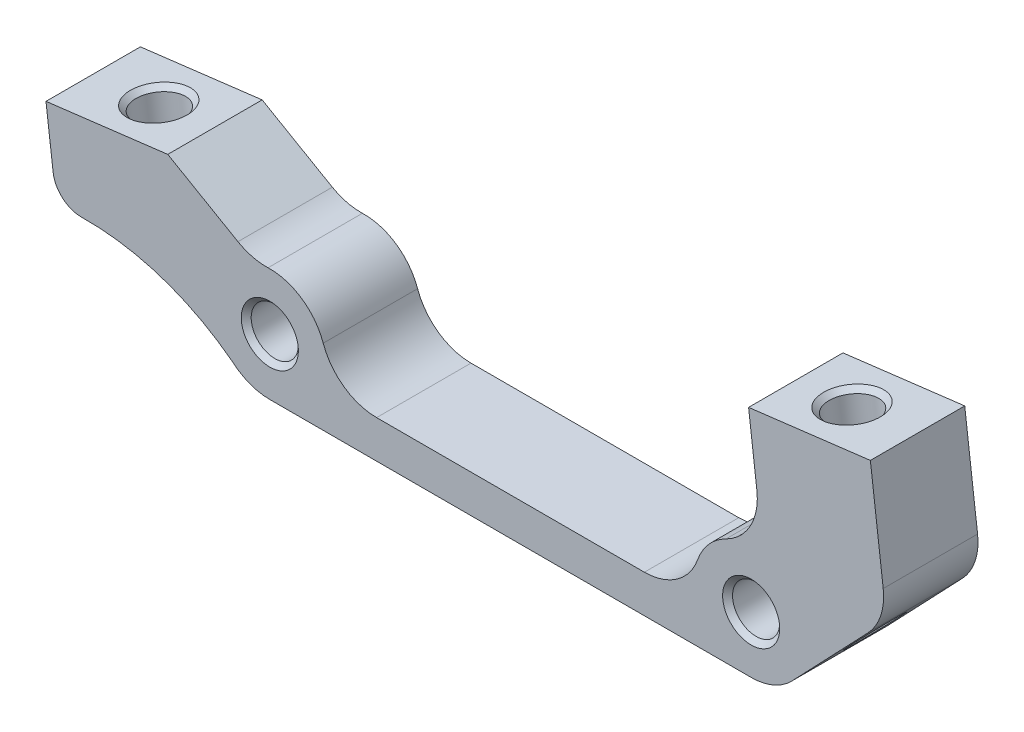
ISO-10303-21;
HEADER;
FILE_DESCRIPTION(('STEP AP214'),'2;1');
FILE_NAME('part.step','',(''),(''),'','','');
FILE_SCHEMA(('AUTOMOTIVE_DESIGN { 1 0 10303 214 1 1 1 1 }'));
ENDSEC;
DATA;
#1=APPLICATION_CONTEXT('core data for automotive mechanical design processes');
#2=APPLICATION_PROTOCOL_DEFINITION('international standard','automotive_design',2000,#1);
#3=PRODUCT_CONTEXT('',#1,'mechanical');
#4=PRODUCT('Part','Part','',(#3));
#5=PRODUCT_RELATED_PRODUCT_CATEGORY('part','',(#4));
#6=PRODUCT_DEFINITION_FORMATION('','',#4);
#7=PRODUCT_DEFINITION_CONTEXT('part definition',#1,'design');
#8=PRODUCT_DEFINITION('design','',#6,#7);
#9=PRODUCT_DEFINITION_SHAPE('','',#8);
#10=(LENGTH_UNIT() NAMED_UNIT(*) SI_UNIT(.MILLI.,.METRE.));
#11=(NAMED_UNIT(*) PLANE_ANGLE_UNIT() SI_UNIT($,.RADIAN.));
#12=(NAMED_UNIT(*) SI_UNIT($,.STERADIAN.) SOLID_ANGLE_UNIT());
#13=UNCERTAINTY_MEASURE_WITH_UNIT(LENGTH_MEASURE(1.E-05),#10,'distance_accuracy_value','');
#14=(GEOMETRIC_REPRESENTATION_CONTEXT(3) GLOBAL_UNCERTAINTY_ASSIGNED_CONTEXT((#13)) GLOBAL_UNIT_ASSIGNED_CONTEXT((#10,
#11,#12)) REPRESENTATION_CONTEXT('',''));
#15=CARTESIAN_POINT('',(0.,0.,0.));
#16=DIRECTION('',(0.,0.,1.));
#17=DIRECTION('',(1.,0.,0.));
#18=AXIS2_PLACEMENT_3D('',#15,#16,#17);
#19=CARTESIAN_POINT('',(112.905556123764,-10.155940073723,10.));
#20=DIRECTION('',(0.,0.,-1.));
#21=DIRECTION('',(-1.,0.,0.));
#22=AXIS2_PLACEMENT_3D('',#19,#20,#21);
#23=PLANE('',#22);
#24=CARTESIAN_POINT('',(67.2545349565775,-20.8978405315615,10.));
#25=DIRECTION('',(0.,0.,1.));
#26=DIRECTION('',(1.,0.,0.));
#27=AXIS2_PLACEMENT_3D('',#24,#25,#26);
#28=CIRCLE('',#27,3.025);
#29=CARTESIAN_POINT('',(70.2795349565775,-20.8978405315615,10.));
#30=VERTEX_POINT('',#29);
#31=EDGE_CURVE('E369',#30,#30,#28,.T.);
#32=ORIENTED_EDGE('',*,*,#31,.F.);
#33=EDGE_LOOP('',(#32));
#34=FACE_BOUND('',#33,.T.);
#35=DIRECTION('',(-0.992546151641322,-0.121869343405148,0.));
#36=VECTOR('',#35,1.);
#37=CARTESIAN_POINT('',(130.883213408734,-0.667537051545507,10.));
#38=LINE('',#37,#36);
#39=CARTESIAN_POINT('',(130.883213408734,-0.667537051545507,10.));
#40=VERTEX_POINT('',#39);
#41=CARTESIAN_POINT('',(117.980113437397,-2.25183851581243,10.));
#42=VERTEX_POINT('',#41);
#43=EDGE_CURVE('E294',#40,#42,#38,.T.);
#44=ORIENTED_EDGE('',*,*,#43,.T.);
#45=DIRECTION('',(0.121869343405149,-0.992546151641322,0.));
#46=VECTOR('',#45,1.);
#47=CARTESIAN_POINT('',(117.980113437397,-2.25183851581243,10.));
#48=LINE('',#47,#46);
#49=CARTESIAN_POINT('',(118.860833033612,-9.42472401329213,10.));
#50=VERTEX_POINT('',#49);
#51=EDGE_CURVE('E157',#42,#50,#48,.T.);
#52=ORIENTED_EDGE('',*,*,#51,.T.);
#53=CARTESIAN_POINT('',(112.905556123764,-10.155940073723,10.));
#54=DIRECTION('',(0.,0.,-1.));
#55=DIRECTION('',(-1.,0.,0.));
#56=AXIS2_PLACEMENT_3D('',#53,#54,#55);
#57=CIRCLE('',#56,6.00000000000001);
#58=CARTESIAN_POINT('',(115.580045540171,-15.5268903026422,10.));
#59=VERTEX_POINT('',#58);
#60=EDGE_CURVE('E411',#50,#59,#57,.T.);
#61=ORIENTED_EDGE('',*,*,#60,.T.);
#62=CARTESIAN_POINT('',(118.254534956578,-20.8978405315615,10.));
#63=DIRECTION('',(0.,0.,1.));
#64=DIRECTION('',(1.,0.,0.));
#65=AXIS2_PLACEMENT_3D('',#62,#63,#64);
#66=CIRCLE('',#65,5.99999999999999);
#67=CARTESIAN_POINT('',(112.597680707085,-18.8978405315615,10.));
#68=VERTEX_POINT('',#67);
#69=EDGE_CURVE('E413',#59,#68,#66,.T.);
#70=ORIENTED_EDGE('',*,*,#69,.T.);
#71=CARTESIAN_POINT('',(106.940826457593,-16.8978405315615,10.));
#72=DIRECTION('',(0.,0.,-1.));
#73=DIRECTION('',(1.,0.,0.));
#74=AXIS2_PLACEMENT_3D('',#71,#72,#73);
#75=CIRCLE('',#74,6.);
#76=CARTESIAN_POINT('',(106.940826457593,-22.8978405315615,10.));
#77=VERTEX_POINT('',#76);
#78=EDGE_CURVE('E416',#68,#77,#75,.T.);
#79=ORIENTED_EDGE('',*,*,#78,.T.);
#80=DIRECTION('',(-1.,0.,0.));
#81=VECTOR('',#80,1.);
#82=CARTESIAN_POINT('',(78.5682434555623,-22.8978405315615,10.));
#83=LINE('',#82,#81);
#84=CARTESIAN_POINT('',(78.5682434555623,-22.8978405315615,10.));
#85=VERTEX_POINT('',#84);
#86=EDGE_CURVE('E419',#77,#85,#83,.T.);
#87=ORIENTED_EDGE('',*,*,#86,.T.);
#88=CARTESIAN_POINT('',(78.5682434555623,-16.8978405315615,10.));
#89=DIRECTION('',(0.,0.,-1.));
#90=DIRECTION('',(-1.,0.,0.));
#91=AXIS2_PLACEMENT_3D('',#88,#89,#90);
#92=CIRCLE('',#91,6.);
#93=CARTESIAN_POINT('',(72.9113892060699,-18.8978405315615,10.));
#94=VERTEX_POINT('',#93);
#95=EDGE_CURVE('E422',#85,#94,#92,.T.);
#96=ORIENTED_EDGE('',*,*,#95,.T.);
#97=CARTESIAN_POINT('',(67.2545349565775,-20.8978405315615,10.));
#98=DIRECTION('',(0.,0.,1.));
#99=DIRECTION('',(1.,0.,0.));
#100=AXIS2_PLACEMENT_3D('',#97,#98,#99);
#101=CIRCLE('',#100,5.99999999999999);
#102=CARTESIAN_POINT('',(67.0655553874647,-14.9008173764905,10.));
#103=VERTEX_POINT('',#102);
#104=EDGE_CURVE('E425',#94,#103,#101,.T.);
#105=ORIENTED_EDGE('',*,*,#104,.T.);
#106=CARTESIAN_POINT('',(66.8765758183518,-8.90379422141946,10.));
#107=DIRECTION('',(0.,0.,-1.));
#108=DIRECTION('',(1.,0.,0.));
#109=AXIS2_PLACEMENT_3D('',#106,#107,#108);
#110=CIRCLE('',#109,6.);
#111=CARTESIAN_POINT('',(63.8765758183518,-14.0999466441261,10.));
#112=VERTEX_POINT('',#111);
#113=EDGE_CURVE('E428',#103,#112,#110,.T.);
#114=ORIENTED_EDGE('',*,*,#113,.T.);
#115=DIRECTION('',(-0.866025403784438,0.500000000000001,0.));
#116=VECTOR('',#115,1.);
#117=CARTESIAN_POINT('',(56.4422520356348,-9.80773780693161,10.));
#118=LINE('',#117,#116);
#119=CARTESIAN_POINT('',(56.4422520356348,-9.80773780693161,10.));
#120=VERTEX_POINT('',#119);
#121=EDGE_CURVE('E431',#112,#120,#118,.T.);
#122=ORIENTED_EDGE('',*,*,#121,.T.);
#123=DIRECTION('',(-0.992546151641322,-0.121869343405148,0.));
#124=VECTOR('',#123,1.);
#125=CARTESIAN_POINT('',(43.5391520642976,-11.3920392711985,10.));
#126=LINE('',#125,#124);
#127=CARTESIAN_POINT('',(43.5391520642976,-11.3920392711985,10.));
#128=VERTEX_POINT('',#127);
#129=EDGE_CURVE('E434',#120,#128,#126,.T.);
#130=ORIENTED_EDGE('',*,*,#129,.T.);
#131=DIRECTION('',(0.121869343405149,-0.992546151641322,0.));
#132=VECTOR('',#131,1.);
#133=CARTESIAN_POINT('',(43.5391520642976,-11.3920392711985,10.));
#134=LINE('',#133,#132);
#135=CARTESIAN_POINT('',(44.289626193266,-17.504160562749,10.));
#136=VERTEX_POINT('',#135);
#137=EDGE_CURVE('E437',#128,#136,#134,.T.);
#138=ORIENTED_EDGE('',*,*,#137,.T.);
#139=CARTESIAN_POINT('',(47.2672646481899,-17.1385525325336,10.));
#140=DIRECTION('',(0.,0.,1.));
#141=DIRECTION('',(1.,0.,0.));
#142=AXIS2_PLACEMENT_3D('',#139,#140,#141);
#143=CIRCLE('',#142,3.);
#144=CARTESIAN_POINT('',(47.3180286660816,-20.1381230041991,10.));
#145=VERTEX_POINT('',#144);
#146=EDGE_CURVE('E440',#136,#145,#143,.T.);
#147=ORIENTED_EDGE('',*,*,#146,.T.);
#148=CARTESIAN_POINT('',(47.7504706256944,-45.690476553773,10.));
#149=DIRECTION('',(0.,0.,-1.));
#150=DIRECTION('',(-1.,0.,0.));
#151=AXIS2_PLACEMENT_3D('',#148,#149,#150);
#152=CIRCLE('',#151,25.5560125600779);
#153=CARTESIAN_POINT('',(63.2925894235512,-25.4037241955427,10.));
#154=VERTEX_POINT('',#153);
#155=EDGE_CURVE('E443',#145,#154,#152,.T.);
#156=ORIENTED_EDGE('',*,*,#155,.T.);
#157=CARTESIAN_POINT('',(67.2545349565775,-20.8978405315615,10.));
#158=DIRECTION('',(0.,0.,1.));
#159=DIRECTION('',(1.,0.,0.));
#160=AXIS2_PLACEMENT_3D('',#157,#158,#159);
#161=CIRCLE('',#160,5.99999999999999);
#162=CARTESIAN_POINT('',(67.2545349565775,-26.8978405315615,10.));
#163=VERTEX_POINT('',#162);
#164=EDGE_CURVE('E446',#154,#163,#161,.T.);
#165=ORIENTED_EDGE('',*,*,#164,.T.);
#166=DIRECTION('',(1.,0.,0.));
#167=VECTOR('',#166,1.);
#168=CARTESIAN_POINT('',(67.2545349565775,-26.8978405315615,10.));
#169=LINE('',#168,#167);
#170=CARTESIAN_POINT('',(118.254534956578,-26.8978405315615,10.));
#171=VERTEX_POINT('',#170);
#172=EDGE_CURVE('E449',#163,#171,#169,.T.);
#173=ORIENTED_EDGE('',*,*,#172,.T.);
#174=CARTESIAN_POINT('',(118.254534956578,-20.8978405315615,10.));
#175=DIRECTION('',(0.,0.,1.));
#176=DIRECTION('',(1.,0.,0.));
#177=AXIS2_PLACEMENT_3D('',#174,#175,#176);
#178=CIRCLE('',#177,5.99999999999998);
#179=CARTESIAN_POINT('',(122.596022679338,-25.0392755911899,10.));
#180=VERTEX_POINT('',#179);
#181=EDGE_CURVE('E212',#171,#180,#178,.T.);
#182=ORIENTED_EDGE('',*,*,#181,.T.);
#183=DIRECTION('',(0.690239176604741,0.723581287126753,0.));
#184=VECTOR('',#183,1.);
#185=CARTESIAN_POINT('',(122.596022679338,-25.0392755911899,10.));
#186=LINE('',#185,#184);
#187=CARTESIAN_POINT('',(130.629567817569,-16.6176688085881,10.));
#188=VERTEX_POINT('',#187);
#189=EDGE_CURVE('E206',#180,#188,#186,.T.);
#190=ORIENTED_EDGE('',*,*,#189,.T.);
#191=CARTESIAN_POINT('',(126.288080094808,-12.4762337489596,10.));
#192=DIRECTION('',(0.,0.,1.));
#193=DIRECTION('',(-1.,0.,0.));
#194=AXIS2_PLACEMENT_3D('',#191,#192,#193);
#195=CIRCLE('',#194,5.99999999999999);
#196=CARTESIAN_POINT('',(132.243357004656,-11.7450176885287,10.));
#197=VERTEX_POINT('',#196);
#198=EDGE_CURVE('E210',#188,#197,#195,.T.);
#199=ORIENTED_EDGE('',*,*,#198,.T.);
#200=DIRECTION('',(-0.121869343405152,0.992546151641322,0.));
#201=VECTOR('',#200,1.);
#202=CARTESIAN_POINT('',(130.883213408734,-0.667537051545507,10.));
#203=LINE('',#202,#201);
#204=EDGE_CURVE('E78',#197,#40,#203,.T.);
#205=ORIENTED_EDGE('',*,*,#204,.T.);
#206=EDGE_LOOP('',(#44,#52,#61,#70,#79,#87,#96,#105,#114,#122,#130,#138,#147,#156,#165,#173,
#182,#190,#199,#205));
#207=FACE_BOUND('',#206,.T.);
#208=CARTESIAN_POINT('',(118.254534956578,-20.8978405315615,10.));
#209=DIRECTION('',(0.,0.,1.));
#210=DIRECTION('',(1.,0.,0.));
#211=AXIS2_PLACEMENT_3D('',#208,#209,#210);
#212=CIRCLE('',#211,3.025);
#213=CARTESIAN_POINT('',(121.279534956578,-20.8978405315615,10.));
#214=VERTEX_POINT('',#213);
#215=EDGE_CURVE('E396',#214,#214,#212,.T.);
#216=ORIENTED_EDGE('',*,*,#215,.F.);
#217=EDGE_LOOP('',(#216));
#218=FACE_BOUND('',#217,.T.);
#219=ADVANCED_FACE('F53',(#34,#207,#218),#23,.F.);
#220=CARTESIAN_POINT('',(112.905556123764,-10.155940073723,0.));
#221=DIRECTION('',(0.,0.,-1.));
#222=DIRECTION('',(-1.,0.,0.));
#223=AXIS2_PLACEMENT_3D('',#220,#221,#222);
#224=PLANE('',#223);
#225=CARTESIAN_POINT('',(67.2545349565775,-20.8978405315615,0.));
#226=DIRECTION('',(0.,0.,1.));
#227=DIRECTION('',(1.,0.,0.));
#228=AXIS2_PLACEMENT_3D('',#225,#226,#227);
#229=CIRCLE('',#228,3.025);
#230=CARTESIAN_POINT('',(70.2795349565775,-20.8978405315615,0.));
#231=VERTEX_POINT('',#230);
#232=EDGE_CURVE('E362',#231,#231,#229,.T.);
#233=ORIENTED_EDGE('',*,*,#232,.T.);
#234=EDGE_LOOP('',(#233));
#235=FACE_BOUND('',#234,.T.);
#236=CARTESIAN_POINT('',(118.254534956578,-20.8978405315615,0.));
#237=DIRECTION('',(0.,0.,1.));
#238=DIRECTION('',(1.,0.,0.));
#239=AXIS2_PLACEMENT_3D('',#236,#237,#238);
#240=CIRCLE('',#239,3.025);
#241=CARTESIAN_POINT('',(121.279534956578,-20.8978405315615,0.));
#242=VERTEX_POINT('',#241);
#243=EDGE_CURVE('E392',#242,#242,#240,.T.);
#244=ORIENTED_EDGE('',*,*,#243,.T.);
#245=EDGE_LOOP('',(#244));
#246=FACE_BOUND('',#245,.T.);
#247=DIRECTION('',(-0.992546151641322,-0.121869343405148,0.));
#248=VECTOR('',#247,1.);
#249=CARTESIAN_POINT('',(130.883213408734,-0.667537051545507,0.));
#250=LINE('',#249,#248);
#251=CARTESIAN_POINT('',(130.883213408734,-0.667537051545507,0.));
#252=VERTEX_POINT('',#251);
#253=CARTESIAN_POINT('',(117.980113437397,-2.25183851581243,0.));
#254=VERTEX_POINT('',#253);
#255=EDGE_CURVE('E236',#252,#254,#250,.T.);
#256=ORIENTED_EDGE('',*,*,#255,.F.);
#257=DIRECTION('',(-0.121869343405152,0.992546151641322,0.));
#258=VECTOR('',#257,1.);
#259=CARTESIAN_POINT('',(130.883213408734,-0.667537051545507,0.));
#260=LINE('',#259,#258);
#261=CARTESIAN_POINT('',(132.243357004656,-11.7450176885287,0.));
#262=VERTEX_POINT('',#261);
#263=EDGE_CURVE('E149',#262,#252,#260,.T.);
#264=ORIENTED_EDGE('',*,*,#263,.F.);
#265=CARTESIAN_POINT('',(126.288080094808,-12.4762337489596,0.));
#266=DIRECTION('',(0.,0.,1.));
#267=DIRECTION('',(-1.,0.,0.));
#268=AXIS2_PLACEMENT_3D('',#265,#266,#267);
#269=CIRCLE('',#268,5.99999999999999);
#270=CARTESIAN_POINT('',(130.629567817569,-16.6176688085881,0.));
#271=VERTEX_POINT('',#270);
#272=EDGE_CURVE('E143',#271,#262,#269,.T.);
#273=ORIENTED_EDGE('',*,*,#272,.F.);
#274=DIRECTION('',(0.690239176604741,0.723581287126753,0.));
#275=VECTOR('',#274,1.);
#276=CARTESIAN_POINT('',(122.596022679338,-25.0392755911899,0.));
#277=LINE('',#276,#275);
#278=CARTESIAN_POINT('',(122.596022679338,-25.0392755911899,0.));
#279=VERTEX_POINT('',#278);
#280=EDGE_CURVE('E221',#279,#271,#277,.T.);
#281=ORIENTED_EDGE('',*,*,#280,.F.);
#282=CARTESIAN_POINT('',(118.254534956578,-20.8978405315615,0.));
#283=DIRECTION('',(0.,0.,1.));
#284=DIRECTION('',(1.,0.,0.));
#285=AXIS2_PLACEMENT_3D('',#282,#283,#284);
#286=CIRCLE('',#285,5.99999999999998);
#287=CARTESIAN_POINT('',(118.254534956578,-26.8978405315615,0.));
#288=VERTEX_POINT('',#287);
#289=EDGE_CURVE('E285',#288,#279,#286,.T.);
#290=ORIENTED_EDGE('',*,*,#289,.F.);
#291=DIRECTION('',(1.,0.,0.));
#292=VECTOR('',#291,1.);
#293=CARTESIAN_POINT('',(67.2545349565775,-26.8978405315615,0.));
#294=LINE('',#293,#292);
#295=CARTESIAN_POINT('',(67.2545349565775,-26.8978405315615,0.));
#296=VERTEX_POINT('',#295);
#297=EDGE_CURVE('E282',#296,#288,#294,.T.);
#298=ORIENTED_EDGE('',*,*,#297,.F.);
#299=CARTESIAN_POINT('',(67.2545349565775,-20.8978405315615,0.));
#300=DIRECTION('',(0.,0.,1.));
#301=DIRECTION('',(1.,0.,0.));
#302=AXIS2_PLACEMENT_3D('',#299,#300,#301);
#303=CIRCLE('',#302,5.99999999999999);
#304=CARTESIAN_POINT('',(63.2925894235512,-25.4037241955427,0.));
#305=VERTEX_POINT('',#304);
#306=EDGE_CURVE('E279',#305,#296,#303,.T.);
#307=ORIENTED_EDGE('',*,*,#306,.F.);
#308=CARTESIAN_POINT('',(47.7504706256944,-45.690476553773,0.));
#309=DIRECTION('',(0.,0.,-1.));
#310=DIRECTION('',(-1.,0.,0.));
#311=AXIS2_PLACEMENT_3D('',#308,#309,#310);
#312=CIRCLE('',#311,25.5560125600779);
#313=CARTESIAN_POINT('',(47.3180286660816,-20.1381230041991,0.));
#314=VERTEX_POINT('',#313);
#315=EDGE_CURVE('E276',#314,#305,#312,.T.);
#316=ORIENTED_EDGE('',*,*,#315,.F.);
#317=CARTESIAN_POINT('',(47.2672646481899,-17.1385525325336,0.));
#318=DIRECTION('',(0.,0.,1.));
#319=DIRECTION('',(1.,0.,0.));
#320=AXIS2_PLACEMENT_3D('',#317,#318,#319);
#321=CIRCLE('',#320,3.);
#322=CARTESIAN_POINT('',(44.289626193266,-17.504160562749,0.));
#323=VERTEX_POINT('',#322);
#324=EDGE_CURVE('E273',#323,#314,#321,.T.);
#325=ORIENTED_EDGE('',*,*,#324,.F.);
#326=DIRECTION('',(0.121869343405149,-0.992546151641322,0.));
#327=VECTOR('',#326,1.);
#328=CARTESIAN_POINT('',(43.5391520642976,-11.3920392711985,0.));
#329=LINE('',#328,#327);
#330=CARTESIAN_POINT('',(43.5391520642976,-11.3920392711985,0.));
#331=VERTEX_POINT('',#330);
#332=EDGE_CURVE('E270',#331,#323,#329,.T.);
#333=ORIENTED_EDGE('',*,*,#332,.F.);
#334=DIRECTION('',(-0.992546151641322,-0.121869343405148,0.));
#335=VECTOR('',#334,1.);
#336=CARTESIAN_POINT('',(43.5391520642976,-11.3920392711985,0.));
#337=LINE('',#336,#335);
#338=CARTESIAN_POINT('',(56.4422520356348,-9.80773780693161,0.));
#339=VERTEX_POINT('',#338);
#340=EDGE_CURVE('E267',#339,#331,#337,.T.);
#341=ORIENTED_EDGE('',*,*,#340,.F.);
#342=DIRECTION('',(-0.866025403784438,0.500000000000001,0.));
#343=VECTOR('',#342,1.);
#344=CARTESIAN_POINT('',(56.4422520356348,-9.80773780693161,0.));
#345=LINE('',#344,#343);
#346=CARTESIAN_POINT('',(63.8765758183518,-14.0999466441261,0.));
#347=VERTEX_POINT('',#346);
#348=EDGE_CURVE('E265',#347,#339,#345,.T.);
#349=ORIENTED_EDGE('',*,*,#348,.F.);
#350=CARTESIAN_POINT('',(66.8765758183518,-8.90379422141946,0.));
#351=DIRECTION('',(0.,0.,-1.));
#352=DIRECTION('',(1.,0.,0.));
#353=AXIS2_PLACEMENT_3D('',#350,#351,#352);
#354=CIRCLE('',#353,6.);
#355=CARTESIAN_POINT('',(67.0655553874647,-14.9008173764905,0.));
#356=VERTEX_POINT('',#355);
#357=EDGE_CURVE('E262',#356,#347,#354,.T.);
#358=ORIENTED_EDGE('',*,*,#357,.F.);
#359=CARTESIAN_POINT('',(67.2545349565775,-20.8978405315615,0.));
#360=DIRECTION('',(0.,0.,1.));
#361=DIRECTION('',(1.,0.,0.));
#362=AXIS2_PLACEMENT_3D('',#359,#360,#361);
#363=CIRCLE('',#362,5.99999999999999);
#364=CARTESIAN_POINT('',(72.9113892060699,-18.8978405315615,0.));
#365=VERTEX_POINT('',#364);
#366=EDGE_CURVE('E259',#365,#356,#363,.T.);
#367=ORIENTED_EDGE('',*,*,#366,.F.);
#368=CARTESIAN_POINT('',(78.5682434555623,-16.8978405315615,0.));
#369=DIRECTION('',(0.,0.,-1.));
#370=DIRECTION('',(-1.,0.,0.));
#371=AXIS2_PLACEMENT_3D('',#368,#369,#370);
#372=CIRCLE('',#371,6.);
#373=CARTESIAN_POINT('',(78.5682434555623,-22.8978405315615,0.));
#374=VERTEX_POINT('',#373);
#375=EDGE_CURVE('E256',#374,#365,#372,.T.);
#376=ORIENTED_EDGE('',*,*,#375,.F.);
#377=DIRECTION('',(-1.,0.,0.));
#378=VECTOR('',#377,1.);
#379=CARTESIAN_POINT('',(78.5682434555623,-22.8978405315615,0.));
#380=LINE('',#379,#378);
#381=CARTESIAN_POINT('',(106.940826457593,-22.8978405315615,0.));
#382=VERTEX_POINT('',#381);
#383=EDGE_CURVE('E253',#382,#374,#380,.T.);
#384=ORIENTED_EDGE('',*,*,#383,.F.);
#385=CARTESIAN_POINT('',(106.940826457593,-16.8978405315615,0.));
#386=DIRECTION('',(0.,0.,-1.));
#387=DIRECTION('',(1.,0.,0.));
#388=AXIS2_PLACEMENT_3D('',#385,#386,#387);
#389=CIRCLE('',#388,6.);
#390=CARTESIAN_POINT('',(112.597680707085,-18.8978405315615,0.));
#391=VERTEX_POINT('',#390);
#392=EDGE_CURVE('E250',#391,#382,#389,.T.);
#393=ORIENTED_EDGE('',*,*,#392,.F.);
#394=CARTESIAN_POINT('',(118.254534956578,-20.8978405315615,0.));
#395=DIRECTION('',(0.,0.,1.));
#396=DIRECTION('',(1.,0.,0.));
#397=AXIS2_PLACEMENT_3D('',#394,#395,#396);
#398=CIRCLE('',#397,5.99999999999999);
#399=CARTESIAN_POINT('',(115.580045540171,-15.5268903026422,0.));
#400=VERTEX_POINT('',#399);
#401=EDGE_CURVE('E247',#400,#391,#398,.T.);
#402=ORIENTED_EDGE('',*,*,#401,.F.);
#403=CARTESIAN_POINT('',(112.905556123764,-10.155940073723,0.));
#404=DIRECTION('',(0.,0.,-1.));
#405=DIRECTION('',(-1.,0.,0.));
#406=AXIS2_PLACEMENT_3D('',#403,#404,#405);
#407=CIRCLE('',#406,6.00000000000001);
#408=CARTESIAN_POINT('',(118.860833033612,-9.42472401329213,0.));
#409=VERTEX_POINT('',#408);
#410=EDGE_CURVE('E244',#409,#400,#407,.T.);
#411=ORIENTED_EDGE('',*,*,#410,.F.);
#412=DIRECTION('',(0.121869343405149,-0.992546151641322,0.));
#413=VECTOR('',#412,1.);
#414=CARTESIAN_POINT('',(117.980113437397,-2.25183851581243,0.));
#415=LINE('',#414,#413);
#416=EDGE_CURVE('E240',#254,#409,#415,.T.);
#417=ORIENTED_EDGE('',*,*,#416,.F.);
#418=EDGE_LOOP('',(#256,#264,#273,#281,#290,#298,#307,#316,#325,#333,#341,#349,#358,#367,#376,
#384,#393,#402,#411,#417));
#419=FACE_BOUND('',#418,.T.);
#420=ADVANCED_FACE('F464',(#235,#246,#419),#224,.T.);
#421=CARTESIAN_POINT('',(130.883213408734,-0.667537051545507,10.));
#422=DIRECTION('',(0.121869343405148,-0.992546151641322,0.));
#423=DIRECTION('',(0.992546151641322,0.121869343405148,0.));
#424=AXIS2_PLACEMENT_3D('',#421,#422,#423);
#425=PLANE('',#424);
#426=CARTESIAN_POINT('',(123.935390347245,-1.52062245538153,5.));
#427=DIRECTION('',(-0.121869343405148,0.992546151641322,0.));
#428=DIRECTION('',(-0.992546151641322,-0.121869343405148,0.));
#429=AXIS2_PLACEMENT_3D('',#426,#427,#428);
#430=CIRCLE('',#429,3.025);
#431=CARTESIAN_POINT('',(120.93293823853,-1.8892772191821,5.));
#432=VERTEX_POINT('',#431);
#433=EDGE_CURVE('E373',#432,#432,#430,.T.);
#434=ORIENTED_EDGE('',*,*,#433,.F.);
#435=EDGE_LOOP('',(#434));
#436=FACE_BOUND('',#435,.T.);
#437=ORIENTED_EDGE('',*,*,#255,.T.);
#438=DIRECTION('',(0.,0.,-1.));
#439=VECTOR('',#438,1.);
#440=CARTESIAN_POINT('',(117.980113437397,-2.25183851581243,10.));
#441=LINE('',#440,#439);
#442=EDGE_CURVE('E11',#42,#254,#441,.T.);
#443=ORIENTED_EDGE('',*,*,#442,.F.);
#444=ORIENTED_EDGE('',*,*,#43,.F.);
#445=DIRECTION('',(0.,0.,-1.));
#446=VECTOR('',#445,1.);
#447=CARTESIAN_POINT('',(130.883213408734,-0.667537051545507,10.));
#448=LINE('',#447,#446);
#449=EDGE_CURVE('E232',#40,#252,#448,.T.);
#450=ORIENTED_EDGE('',*,*,#449,.T.);
#451=EDGE_LOOP('',(#437,#443,#444,#450));
#452=FACE_BOUND('',#451,.T.);
#453=ADVANCED_FACE('F55',(#436,#452),#425,.F.);
#454=CARTESIAN_POINT('',(117.980113437397,-2.25183851581243,10.));
#455=DIRECTION('',(0.992546151641322,0.121869343405149,0.));
#456=DIRECTION('',(-0.121869343405149,0.992546151641322,0.));
#457=AXIS2_PLACEMENT_3D('',#454,#455,#456);
#458=PLANE('',#457);
#459=ORIENTED_EDGE('',*,*,#416,.T.);
#460=DIRECTION('',(0.,0.,-1.));
#461=VECTOR('',#460,1.);
#462=CARTESIAN_POINT('',(118.860833033612,-9.42472401329213,10.));
#463=LINE('',#462,#461);
#464=EDGE_CURVE('E69',#50,#409,#463,.T.);
#465=ORIENTED_EDGE('',*,*,#464,.F.);
#466=ORIENTED_EDGE('',*,*,#51,.F.);
#467=ORIENTED_EDGE('',*,*,#442,.T.);
#468=EDGE_LOOP('',(#459,#465,#466,#467));
#469=FACE_BOUND('',#468,.T.);
#470=ADVANCED_FACE('F600',(#469),#458,.F.);
#471=CARTESIAN_POINT('',(112.905556123764,-10.155940073723,10.));
#472=DIRECTION('',(0.,0.,-1.));
#473=DIRECTION('',(-1.,0.,0.));
#474=AXIS2_PLACEMENT_3D('',#471,#472,#473);
#475=CYLINDRICAL_SURFACE('',#474,6.00000000000001);
#476=ORIENTED_EDGE('',*,*,#410,.T.);
#477=DIRECTION('',(0.,0.,-1.));
#478=VECTOR('',#477,1.);
#479=CARTESIAN_POINT('',(115.580045540171,-15.5268903026422,10.));
#480=LINE('',#479,#478);
#481=EDGE_CURVE('E353',#59,#400,#480,.T.);
#482=ORIENTED_EDGE('',*,*,#481,.F.);
#483=ORIENTED_EDGE('',*,*,#60,.F.);
#484=ORIENTED_EDGE('',*,*,#464,.T.);
#485=EDGE_LOOP('',(#476,#482,#483,#484));
#486=FACE_BOUND('',#485,.T.);
#487=ADVANCED_FACE('F597',(#486),#475,.F.);
#488=CARTESIAN_POINT('',(118.254534956578,-20.8978405315615,10.));
#489=DIRECTION('',(0.,0.,-1.));
#490=DIRECTION('',(-1.,0.,0.));
#491=AXIS2_PLACEMENT_3D('',#488,#489,#490);
#492=CYLINDRICAL_SURFACE('',#491,5.99999999999999);
#493=ORIENTED_EDGE('',*,*,#401,.T.);
#494=DIRECTION('',(0.,0.,-1.));
#495=VECTOR('',#494,1.);
#496=CARTESIAN_POINT('',(112.597680707085,-18.8978405315615,10.));
#497=LINE('',#496,#495);
#498=EDGE_CURVE('E349',#68,#391,#497,.T.);
#499=ORIENTED_EDGE('',*,*,#498,.F.);
#500=ORIENTED_EDGE('',*,*,#69,.F.);
#501=ORIENTED_EDGE('',*,*,#481,.T.);
#502=EDGE_LOOP('',(#493,#499,#500,#501));
#503=FACE_BOUND('',#502,.T.);
#504=ADVANCED_FACE('F593',(#503),#492,.T.);
#505=CARTESIAN_POINT('',(106.940826457593,-16.8978405315615,10.));
#506=DIRECTION('',(0.,0.,-1.));
#507=DIRECTION('',(-1.,0.,0.));
#508=AXIS2_PLACEMENT_3D('',#505,#506,#507);
#509=CYLINDRICAL_SURFACE('',#508,6.);
#510=ORIENTED_EDGE('',*,*,#392,.T.);
#511=DIRECTION('',(0.,0.,-1.));
#512=VECTOR('',#511,1.);
#513=CARTESIAN_POINT('',(106.940826457593,-22.8978405315615,10.));
#514=LINE('',#513,#512);
#515=EDGE_CURVE('E345',#77,#382,#514,.T.);
#516=ORIENTED_EDGE('',*,*,#515,.F.);
#517=ORIENTED_EDGE('',*,*,#78,.F.);
#518=ORIENTED_EDGE('',*,*,#498,.T.);
#519=EDGE_LOOP('',(#510,#516,#517,#518));
#520=FACE_BOUND('',#519,.T.);
#521=ADVANCED_FACE('F589',(#520),#509,.F.);
#522=CARTESIAN_POINT('',(78.5682434555623,-22.8978405315615,10.));
#523=DIRECTION('',(0.,-1.,0.));
#524=DIRECTION('',(0.,0.,-1.));
#525=AXIS2_PLACEMENT_3D('',#522,#523,#524);
#526=PLANE('',#525);
#527=ORIENTED_EDGE('',*,*,#383,.T.);
#528=DIRECTION('',(0.,0.,-1.));
#529=VECTOR('',#528,1.);
#530=CARTESIAN_POINT('',(78.5682434555623,-22.8978405315615,10.));
#531=LINE('',#530,#529);
#532=EDGE_CURVE('E341',#85,#374,#531,.T.);
#533=ORIENTED_EDGE('',*,*,#532,.F.);
#534=ORIENTED_EDGE('',*,*,#86,.F.);
#535=ORIENTED_EDGE('',*,*,#515,.T.);
#536=EDGE_LOOP('',(#527,#533,#534,#535));
#537=FACE_BOUND('',#536,.T.);
#538=ADVANCED_FACE('F585',(#537),#526,.F.);
#539=CARTESIAN_POINT('',(78.5682434555623,-16.8978405315615,10.));
#540=DIRECTION('',(0.,0.,-1.));
#541=DIRECTION('',(-1.,0.,0.));
#542=AXIS2_PLACEMENT_3D('',#539,#540,#541);
#543=CYLINDRICAL_SURFACE('',#542,6.);
#544=ORIENTED_EDGE('',*,*,#375,.T.);
#545=DIRECTION('',(0.,0.,-1.));
#546=VECTOR('',#545,1.);
#547=CARTESIAN_POINT('',(72.9113892060699,-18.8978405315615,10.));
#548=LINE('',#547,#546);
#549=EDGE_CURVE('E337',#94,#365,#548,.T.);
#550=ORIENTED_EDGE('',*,*,#549,.F.);
#551=ORIENTED_EDGE('',*,*,#95,.F.);
#552=ORIENTED_EDGE('',*,*,#532,.T.);
#553=EDGE_LOOP('',(#544,#550,#551,#552));
#554=FACE_BOUND('',#553,.T.);
#555=ADVANCED_FACE('F581',(#554),#543,.F.);
#556=CARTESIAN_POINT('',(67.2545349565775,-20.8978405315615,10.));
#557=DIRECTION('',(0.,0.,-1.));
#558=DIRECTION('',(-1.,0.,0.));
#559=AXIS2_PLACEMENT_3D('',#556,#557,#558);
#560=CYLINDRICAL_SURFACE('',#559,5.99999999999999);
#561=ORIENTED_EDGE('',*,*,#366,.T.);
#562=DIRECTION('',(0.,0.,-1.));
#563=VECTOR('',#562,1.);
#564=CARTESIAN_POINT('',(67.0655553874647,-14.9008173764905,10.));
#565=LINE('',#564,#563);
#566=EDGE_CURVE('E333',#103,#356,#565,.T.);
#567=ORIENTED_EDGE('',*,*,#566,.F.);
#568=ORIENTED_EDGE('',*,*,#104,.F.);
#569=ORIENTED_EDGE('',*,*,#549,.T.);
#570=EDGE_LOOP('',(#561,#567,#568,#569));
#571=FACE_BOUND('',#570,.T.);
#572=ADVANCED_FACE('F577',(#571),#560,.T.);
#573=CARTESIAN_POINT('',(66.8765758183518,-8.90379422141946,10.));
#574=DIRECTION('',(0.,0.,-1.));
#575=DIRECTION('',(-1.,0.,0.));
#576=AXIS2_PLACEMENT_3D('',#573,#574,#575);
#577=CYLINDRICAL_SURFACE('',#576,6.);
#578=ORIENTED_EDGE('',*,*,#357,.T.);
#579=DIRECTION('',(0.,0.,-1.));
#580=VECTOR('',#579,1.);
#581=CARTESIAN_POINT('',(63.8765758183518,-14.0999466441261,10.));
#582=LINE('',#581,#580);
#583=EDGE_CURVE('E329',#112,#347,#582,.T.);
#584=ORIENTED_EDGE('',*,*,#583,.F.);
#585=ORIENTED_EDGE('',*,*,#113,.F.);
#586=ORIENTED_EDGE('',*,*,#566,.T.);
#587=EDGE_LOOP('',(#578,#584,#585,#586));
#588=FACE_BOUND('',#587,.T.);
#589=ADVANCED_FACE('F573',(#588),#577,.F.);
#590=CARTESIAN_POINT('',(56.4422520356348,-9.80773780693161,10.));
#591=DIRECTION('',(-0.500000000000001,-0.866025403784438,0.));
#592=DIRECTION('',(0.866025403784438,-0.500000000000001,0.));
#593=AXIS2_PLACEMENT_3D('',#590,#591,#592);
#594=PLANE('',#593);
#595=ORIENTED_EDGE('',*,*,#348,.T.);
#596=DIRECTION('',(0.,0.,-1.));
#597=VECTOR('',#596,1.);
#598=CARTESIAN_POINT('',(56.4422520356348,-9.80773780693161,10.));
#599=LINE('',#598,#597);
#600=EDGE_CURVE('E325',#120,#339,#599,.T.);
#601=ORIENTED_EDGE('',*,*,#600,.F.);
#602=ORIENTED_EDGE('',*,*,#121,.F.);
#603=ORIENTED_EDGE('',*,*,#583,.T.);
#604=EDGE_LOOP('',(#595,#601,#602,#603));
#605=FACE_BOUND('',#604,.T.);
#606=ADVANCED_FACE('F570',(#605),#594,.F.);
#607=CARTESIAN_POINT('',(43.5391520642976,-11.3920392711985,10.));
#608=DIRECTION('',(0.121869343405148,-0.992546151641322,0.));
#609=DIRECTION('',(0.992546151641322,0.121869343405148,0.));
#610=AXIS2_PLACEMENT_3D('',#607,#608,#609);
#611=PLANE('',#610);
#612=CARTESIAN_POINT('',(50.4869751257869,-10.5389538673625,5.));
#613=DIRECTION('',(-0.121869343405148,0.992546151641322,0.));
#614=DIRECTION('',(-0.992546151641322,-0.121869343405148,0.));
#615=AXIS2_PLACEMENT_3D('',#612,#613,#614);
#616=CIRCLE('',#615,3.025);
#617=CARTESIAN_POINT('',(47.4845230170719,-10.9076086311631,5.));
#618=VERTEX_POINT('',#617);
#619=EDGE_CURVE('E530',#618,#618,#616,.T.);
#620=ORIENTED_EDGE('',*,*,#619,.F.);
#621=EDGE_LOOP('',(#620));
#622=FACE_BOUND('',#621,.T.);
#623=ORIENTED_EDGE('',*,*,#340,.T.);
#624=DIRECTION('',(0.,0.,-1.));
#625=VECTOR('',#624,1.);
#626=CARTESIAN_POINT('',(43.5391520642976,-11.3920392711985,10.));
#627=LINE('',#626,#625);
#628=EDGE_CURVE('E321',#128,#331,#627,.T.);
#629=ORIENTED_EDGE('',*,*,#628,.F.);
#630=ORIENTED_EDGE('',*,*,#129,.F.);
#631=ORIENTED_EDGE('',*,*,#600,.T.);
#632=EDGE_LOOP('',(#623,#629,#630,#631));
#633=FACE_BOUND('',#632,.T.);
#634=ADVANCED_FACE('F566',(#622,#633),#611,.F.);
#635=CARTESIAN_POINT('',(43.5391520642976,-11.3920392711985,10.));
#636=DIRECTION('',(0.992546151641322,0.121869343405149,0.));
#637=DIRECTION('',(-0.121869343405149,0.992546151641322,0.));
#638=AXIS2_PLACEMENT_3D('',#635,#636,#637);
#639=PLANE('',#638);
#640=ORIENTED_EDGE('',*,*,#332,.T.);
#641=DIRECTION('',(0.,0.,-1.));
#642=VECTOR('',#641,1.);
#643=CARTESIAN_POINT('',(44.289626193266,-17.504160562749,10.));
#644=LINE('',#643,#642);
#645=EDGE_CURVE('E317',#136,#323,#644,.T.);
#646=ORIENTED_EDGE('',*,*,#645,.F.);
#647=ORIENTED_EDGE('',*,*,#137,.F.);
#648=ORIENTED_EDGE('',*,*,#628,.T.);
#649=EDGE_LOOP('',(#640,#646,#647,#648));
#650=FACE_BOUND('',#649,.T.);
#651=ADVANCED_FACE('F562',(#650),#639,.F.);
#652=CARTESIAN_POINT('',(47.2672646481899,-17.1385525325336,10.));
#653=DIRECTION('',(0.,0.,-1.));
#654=DIRECTION('',(-1.,0.,0.));
#655=AXIS2_PLACEMENT_3D('',#652,#653,#654);
#656=CYLINDRICAL_SURFACE('',#655,3.);
#657=ORIENTED_EDGE('',*,*,#324,.T.);
#658=DIRECTION('',(0.,0.,-1.));
#659=VECTOR('',#658,1.);
#660=CARTESIAN_POINT('',(47.3180286660816,-20.1381230041991,10.));
#661=LINE('',#660,#659);
#662=EDGE_CURVE('E313',#145,#314,#661,.T.);
#663=ORIENTED_EDGE('',*,*,#662,.F.);
#664=ORIENTED_EDGE('',*,*,#146,.F.);
#665=ORIENTED_EDGE('',*,*,#645,.T.);
#666=EDGE_LOOP('',(#657,#663,#664,#665));
#667=FACE_BOUND('',#666,.T.);
#668=ADVANCED_FACE('F544',(#667),#656,.T.);
#669=CARTESIAN_POINT('',(47.7504706256944,-45.690476553773,10.));
#670=DIRECTION('',(0.,0.,-1.));
#671=DIRECTION('',(-1.,0.,0.));
#672=AXIS2_PLACEMENT_3D('',#669,#670,#671);
#673=CYLINDRICAL_SURFACE('',#672,25.5560125600779);
#674=CARTESIAN_POINT('',(49.1510972564926,-20.1728743346781,5.));
#675=CARTESIAN_POINT('',(49.1511033738387,-20.1728736762128,5.13854428694667));
#676=CARTESIAN_POINT('',(49.1628195056002,-20.173509392255,5.27718264446251));
#677=CARTESIAN_POINT('',(49.2093721819741,-20.1761294763355,5.55061696169447));
#678=CARTESIAN_POINT('',(49.2442346759002,-20.1781153581005,5.68540843158117));
#679=CARTESIAN_POINT('',(49.3360161272223,-20.1836554296189,5.94714108782509));
#680=CARTESIAN_POINT('',(49.3929213020501,-20.1872086395656,6.07408712227698));
#681=CARTESIAN_POINT('',(49.5270544696563,-20.1962022247731,6.31662152937723));
#682=CARTESIAN_POINT('',(49.6042777305212,-20.201642160725,6.43221253791975));
#683=CARTESIAN_POINT('',(49.7770902765896,-20.2147997649183,6.64937886350993));
#684=CARTESIAN_POINT('',(49.8727553090578,-20.2225269001702,6.75089329915907));
#685=CARTESIAN_POINT('',(50.0793677720547,-20.2405895268714,6.93666382657225));
#686=CARTESIAN_POINT('',(50.1903164063791,-20.2509252238346,7.02091855759382));
#687=CARTESIAN_POINT('',(50.4259141890639,-20.2746158906582,7.17118178785516));
#688=CARTESIAN_POINT('',(50.5507369991588,-20.2880120344435,7.23691128805815));
#689=CARTESIAN_POINT('',(50.8091127790001,-20.3178260780479,7.34704531287093));
#690=CARTESIAN_POINT('',(50.9426667625697,-20.3342443291833,7.39144735602146));
#691=CARTESIAN_POINT('',(51.2183793648169,-20.3704606235329,7.45902153810476));
#692=CARTESIAN_POINT('',(51.3606718697429,-20.390336139,7.48160517935117));
#693=CARTESIAN_POINT('',(51.646632288882,-20.432792373408,7.5033068294553));
#694=CARTESIAN_POINT('',(51.7903004468947,-20.4553735803455,7.50242059894176));
#695=CARTESIAN_POINT('',(52.0800462587341,-20.5034396767516,7.47711522275292));
#696=CARTESIAN_POINT('',(52.2260433665536,-20.5289965040931,7.45190861319698));
#697=CARTESIAN_POINT('',(52.5116089554413,-20.5814654531748,7.3776673127662));
#698=CARTESIAN_POINT('',(52.6511762058298,-20.6083778323223,7.32862808088306));
#699=CARTESIAN_POINT('',(52.9231830658139,-20.6630415415107,7.20660742059666));
#700=CARTESIAN_POINT('',(53.0553918729931,-20.6907981298043,7.133112484383));
#701=CARTESIAN_POINT('',(53.3053257887259,-20.7451415309204,6.96424809257397));
#702=CARTESIAN_POINT('',(53.4230505698771,-20.7717283172916,6.86887814264682));
#703=CARTESIAN_POINT('',(53.6386903595109,-20.8218064560221,6.65999052332821));
#704=CARTESIAN_POINT('',(53.736857690968,-20.8453356571472,6.54674317244421));
#705=CARTESIAN_POINT('',(53.9117959482979,-20.8881382029851,6.30405320120614));
#706=CARTESIAN_POINT('',(53.9885751430796,-20.9074131918268,6.17461686782796));
#707=CARTESIAN_POINT('',(54.1138514775173,-20.939292270939,5.91098926342026));
#708=CARTESIAN_POINT('',(54.1637015014181,-20.9522117470546,5.77747988548584));
#709=CARTESIAN_POINT('',(54.2392964148107,-20.9719314572756,5.50338176811539));
#710=CARTESIAN_POINT('',(54.2650527300428,-20.9787345918184,5.3627964176198));
#711=CARTESIAN_POINT('',(54.2904404766633,-20.9854421437375,5.08810299071149));
#712=CARTESIAN_POINT('',(54.2916174474491,-20.9857546799751,4.95414576273736));
#713=CARTESIAN_POINT('',(54.2717312988029,-20.9804979588519,4.68802505312999));
#714=CARTESIAN_POINT('',(54.2506712245365,-20.9749295068401,4.55586132840243));
#715=CARTESIAN_POINT('',(54.187821515836,-20.9584870136924,4.29966166686216));
#716=CARTESIAN_POINT('',(54.1464405820015,-20.947717643331,4.17551798465309));
#717=CARTESIAN_POINT('',(54.0447093608155,-20.9216437379258,3.93579287623182));
#718=CARTESIAN_POINT('',(53.9843564196904,-20.906338568439,3.82021265065858));
#719=CARTESIAN_POINT('',(53.8441317118819,-20.8714825277641,3.59616320769114));
#720=CARTESIAN_POINT('',(53.7636178442342,-20.8517949957264,3.48811796219641));
#721=CARTESIAN_POINT('',(53.5868656898608,-20.8096703874654,3.28639167980714));
#722=CARTESIAN_POINT('',(53.4906228670062,-20.7872325185307,3.19271480180932));
#723=CARTESIAN_POINT('',(53.2784126303034,-20.7392402820951,3.01604038918411));
#724=CARTESIAN_POINT('',(53.1615747633725,-20.7135782904667,2.9341170802492));
#725=CARTESIAN_POINT('',(52.9162588586953,-20.661690543562,2.79032120272675));
#726=CARTESIAN_POINT('',(52.7877775978721,-20.635464633726,2.72845420787318));
#727=CARTESIAN_POINT('',(52.515864114196,-20.5822926295502,2.62359572279021));
#728=CARTESIAN_POINT('',(52.3720067653435,-20.5553750327446,2.58168864794372));
#729=CARTESIAN_POINT('',(52.0789799459324,-20.5032589892382,2.522641932111));
#730=CARTESIAN_POINT('',(51.929809976045,-20.4780607047865,2.50550462554232));
#731=CARTESIAN_POINT('',(51.6289489464018,-20.4300215919539,2.4967113858247));
#732=CARTESIAN_POINT('',(51.4772472681346,-20.4072038108259,2.50528423692491));
#733=CARTESIAN_POINT('',(51.1771580517687,-20.3647870103318,2.54861440402263));
#734=CARTESIAN_POINT('',(51.0287700889855,-20.3451875764341,2.58336834459977));
#735=CARTESIAN_POINT('',(50.7436238229953,-20.309953506016,2.67730908746114));
#736=CARTESIAN_POINT('',(50.606666887994,-20.2942315486483,2.73585939183158));
#737=CARTESIAN_POINT('',(50.3447197234823,-20.2661375670578,2.87599976303386));
#738=CARTESIAN_POINT('',(50.2197267459868,-20.2537647723712,2.95758452202739));
#739=CARTESIAN_POINT('',(49.989833250896,-20.2325124362681,3.1384704378336));
#740=CARTESIAN_POINT('',(49.8843943453692,-20.2235284875327,3.23707545439475));
#741=CARTESIAN_POINT('',(49.6918968960863,-20.2081298814816,3.45105826120601));
#742=CARTESIAN_POINT('',(49.6048401433859,-20.2017154744734,3.56643768401428));
#743=CARTESIAN_POINT('',(49.453782831995,-20.1911800613718,3.80765984275648));
#744=CARTESIAN_POINT('',(49.389282968121,-20.1870081183074,3.93318829738542));
#745=CARTESIAN_POINT('',(49.2825725637536,-20.1803741024918,4.19331240405519));
#746=CARTESIAN_POINT('',(49.2403348659821,-20.177909945277,4.32789678173664));
#747=CARTESIAN_POINT('',(49.1903400341986,-20.1750516055211,4.55276185511195));
#748=CARTESIAN_POINT('',(49.1756443535272,-20.1742316196211,4.64155555744171));
#749=CARTESIAN_POINT('',(49.1560210102025,-20.1731431995808,4.82021963833488));
#750=CARTESIAN_POINT('',(49.1510932865669,-20.1728747619972,4.91009001017303));
#751=CARTESIAN_POINT('',(49.1510972564926,-20.1728743346781,5.));
#752=B_SPLINE_CURVE_WITH_KNOTS('',3,(#674,#675,#676,#677,#678,#679,#680,#681,#682,#683,#684,
#685,#686,#687,#688,#689,#690,#691,#692,#693,#694,#695,#696,#697,#698,#699,#700,#701,#702,#703,
#704,#705,#706,#707,#708,#709,#710,#711,#712,#713,#714,#715,#716,#717,#718,#719,#720,#721,#722,
#723,#724,#725,#726,#727,#728,#729,#730,#731,#732,#733,#734,#735,#736,#737,#738,#739,#740,#741,
#742,#743,#744,#745,#746,#747,#748,#749,#750,#751),.UNSPECIFIED.,.T.,.F.,(4,2,2,2,2,2,2,2,2,2,2,
2,2,2,2,2,2,2,2,2,2,2,2,2,2,2,2,2,2,2,2,2,2,2,2,2,2,2,4),(0.,0.41530387543245,0.831074134700995,
1.24658484495768,1.66199887174479,2.07915698517819,2.4963479744052,2.91952193268325,
3.34274511552297,3.77708898797409,4.21151131664829,4.66048875126938,5.10955176648856,
5.56871114845198,6.02788090752632,6.4806761820921,6.93329615687782,7.36034202925097,
7.78718528472905,8.18710199268091,8.58696394269874,8.97909416456103,9.37127926138741,
9.77804110546037,10.1849204646948,10.6179664239793,11.0511326255957,11.5057143579288,
11.9603389293544,12.4190209882074,12.8776439211842,13.3247319830276,13.7717171061601,
14.203514904753,14.6353547559525,15.0569195542633,15.4779688948319,15.7474870478873,
16.017003518311),.UNSPECIFIED.);
#753=CARTESIAN_POINT('',(49.1510972564926,-20.1728743346781,5.));
#754=VERTEX_POINT('',#753);
#755=EDGE_CURVE('E57',#754,#754,#752,.T.);
#756=ORIENTED_EDGE('',*,*,#755,.T.);
#757=EDGE_LOOP('',(#756));
#758=FACE_BOUND('',#757,.T.);
#759=ORIENTED_EDGE('',*,*,#315,.T.);
#760=DIRECTION('',(0.,0.,-1.));
#761=VECTOR('',#760,1.);
#762=CARTESIAN_POINT('',(63.2925894235512,-25.4037241955427,10.));
#763=LINE('',#762,#761);
#764=EDGE_CURVE('E309',#154,#305,#763,.T.);
#765=ORIENTED_EDGE('',*,*,#764,.F.);
#766=ORIENTED_EDGE('',*,*,#155,.F.);
#767=ORIENTED_EDGE('',*,*,#662,.T.);
#768=EDGE_LOOP('',(#759,#765,#766,#767));
#769=FACE_BOUND('',#768,.T.);
#770=ADVANCED_FACE('F539',(#758,#769),#673,.F.);
#771=CARTESIAN_POINT('',(67.2545349565775,-20.8978405315615,10.));
#772=DIRECTION('',(0.,0.,-1.));
#773=DIRECTION('',(-1.,0.,0.));
#774=AXIS2_PLACEMENT_3D('',#771,#772,#773);
#775=CYLINDRICAL_SURFACE('',#774,5.99999999999999);
#776=ORIENTED_EDGE('',*,*,#306,.T.);
#777=DIRECTION('',(0.,0.,-1.));
#778=VECTOR('',#777,1.);
#779=CARTESIAN_POINT('',(67.2545349565775,-26.8978405315615,10.));
#780=LINE('',#779,#778);
#781=EDGE_CURVE('E305',#163,#296,#780,.T.);
#782=ORIENTED_EDGE('',*,*,#781,.F.);
#783=ORIENTED_EDGE('',*,*,#164,.F.);
#784=ORIENTED_EDGE('',*,*,#764,.T.);
#785=EDGE_LOOP('',(#776,#782,#783,#784));
#786=FACE_BOUND('',#785,.T.);
#787=ADVANCED_FACE('F543',(#786),#775,.T.);
#788=CARTESIAN_POINT('',(67.2545349565775,-26.8978405315615,10.));
#789=DIRECTION('',(0.,1.,0.));
#790=DIRECTION('',(-1.,0.,0.));
#791=AXIS2_PLACEMENT_3D('',#788,#789,#790);
#792=PLANE('',#791);
#793=ORIENTED_EDGE('',*,*,#297,.T.);
#794=DIRECTION('',(0.,0.,-1.));
#795=VECTOR('',#794,1.);
#796=CARTESIAN_POINT('',(118.254534956578,-26.8978405315615,10.));
#797=LINE('',#796,#795);
#798=EDGE_CURVE('E301',#171,#288,#797,.T.);
#799=ORIENTED_EDGE('',*,*,#798,.F.);
#800=ORIENTED_EDGE('',*,*,#172,.F.);
#801=ORIENTED_EDGE('',*,*,#781,.T.);
#802=EDGE_LOOP('',(#793,#799,#800,#801));
#803=FACE_BOUND('',#802,.T.);
#804=ADVANCED_FACE('F457',(#803),#792,.F.);
#805=CARTESIAN_POINT('',(118.254534956578,-20.8978405315615,10.));
#806=DIRECTION('',(0.,0.,-1.));
#807=DIRECTION('',(-1.,0.,0.));
#808=AXIS2_PLACEMENT_3D('',#805,#806,#807);
#809=CYLINDRICAL_SURFACE('',#808,5.99999999999998);
#810=ORIENTED_EDGE('',*,*,#289,.T.);
#811=DIRECTION('',(0.,0.,-1.));
#812=VECTOR('',#811,1.);
#813=CARTESIAN_POINT('',(122.596022679338,-25.0392755911899,10.));
#814=LINE('',#813,#812);
#815=EDGE_CURVE('E223',#180,#279,#814,.T.);
#816=ORIENTED_EDGE('',*,*,#815,.F.);
#817=ORIENTED_EDGE('',*,*,#181,.F.);
#818=ORIENTED_EDGE('',*,*,#798,.T.);
#819=EDGE_LOOP('',(#810,#816,#817,#818));
#820=FACE_BOUND('',#819,.T.);
#821=ADVANCED_FACE('F461',(#820),#809,.T.);
#822=CARTESIAN_POINT('',(122.596022679338,-25.0392755911899,10.));
#823=DIRECTION('',(-0.723581287126753,0.690239176604741,0.));
#824=DIRECTION('',(-0.690239176604741,-0.723581287126753,0.));
#825=AXIS2_PLACEMENT_3D('',#822,#823,#824);
#826=PLANE('',#825);
#827=CARTESIAN_POINT('',(126.341071331115,-21.1133217832143,5.));
#828=DIRECTION('',(-0.723581287126753,0.690239176604741,0.));
#829=DIRECTION('',(0.690239176604741,0.723581287126753,0.));
#830=AXIS2_PLACEMENT_3D('',#827,#828,#829);
#831=ELLIPSE('',#830,3.23299573801666,2.5);
#832=CARTESIAN_POINT('',(128.572611647291,-18.7739865658249,5.));
#833=VERTEX_POINT('',#832);
#834=EDGE_CURVE('E359',#833,#833,#831,.T.);
#835=ORIENTED_EDGE('',*,*,#834,.T.);
#836=EDGE_LOOP('',(#835));
#837=FACE_BOUND('',#836,.T.);
#838=ORIENTED_EDGE('',*,*,#280,.T.);
#839=DIRECTION('',(0.,0.,-1.));
#840=VECTOR('',#839,1.);
#841=CARTESIAN_POINT('',(130.629567817569,-16.6176688085881,10.));
#842=LINE('',#841,#840);
#843=EDGE_CURVE('E218',#188,#271,#842,.T.);
#844=ORIENTED_EDGE('',*,*,#843,.F.);
#845=ORIENTED_EDGE('',*,*,#189,.F.);
#846=ORIENTED_EDGE('',*,*,#815,.T.);
#847=EDGE_LOOP('',(#838,#844,#845,#846));
#848=FACE_BOUND('',#847,.T.);
#849=ADVANCED_FACE('F219',(#837,#848),#826,.F.);
#850=CARTESIAN_POINT('',(126.288080094808,-12.4762337489596,10.));
#851=DIRECTION('',(0.,0.,-1.));
#852=DIRECTION('',(-1.,0.,0.));
#853=AXIS2_PLACEMENT_3D('',#850,#851,#852);
#854=CYLINDRICAL_SURFACE('',#853,5.99999999999999);
#855=ORIENTED_EDGE('',*,*,#272,.T.);
#856=DIRECTION('',(0.,0.,-1.));
#857=VECTOR('',#856,1.);
#858=CARTESIAN_POINT('',(132.243357004656,-11.7450176885287,10.));
#859=LINE('',#858,#857);
#860=EDGE_CURVE('E224',#197,#262,#859,.T.);
#861=ORIENTED_EDGE('',*,*,#860,.F.);
#862=ORIENTED_EDGE('',*,*,#198,.F.);
#863=ORIENTED_EDGE('',*,*,#843,.T.);
#864=EDGE_LOOP('',(#855,#861,#862,#863));
#865=FACE_BOUND('',#864,.T.);
#866=ADVANCED_FACE('F226',(#865),#854,.T.);
#867=CARTESIAN_POINT('',(130.883213408734,-0.667537051545507,10.));
#868=DIRECTION('',(-0.992546151641322,-0.121869343405152,0.));
#869=DIRECTION('',(0.121869343405152,-0.992546151641322,0.));
#870=AXIS2_PLACEMENT_3D('',#867,#868,#869);
#871=PLANE('',#870);
#872=ORIENTED_EDGE('',*,*,#263,.T.);
#873=ORIENTED_EDGE('',*,*,#449,.F.);
#874=ORIENTED_EDGE('',*,*,#204,.F.);
#875=ORIENTED_EDGE('',*,*,#860,.T.);
#876=EDGE_LOOP('',(#872,#873,#874,#875));
#877=FACE_BOUND('',#876,.T.);
#878=ADVANCED_FACE('F469',(#877),#871,.F.);
#879=CARTESIAN_POINT('',(118.254534956578,-20.8978405315615,10.));
#880=DIRECTION('',(0.,0.,1.));
#881=DIRECTION('',(1.,0.,0.));
#882=AXIS2_PLACEMENT_3D('',#879,#880,#881);
#883=CONICAL_SURFACE('',#882,3.025,0.785398163397433);
#884=CARTESIAN_POINT('',(118.254534956578,-20.8978405315615,9.47499999999997));
#885=DIRECTION('',(0.,0.,1.));
#886=DIRECTION('',(1.,0.,0.));
#887=AXIS2_PLACEMENT_3D('',#884,#885,#886);
#888=CIRCLE('',#887,2.49999999999999);
#889=CARTESIAN_POINT('',(120.754534956578,-20.8978405315615,9.47499999999997));
#890=VERTEX_POINT('',#889);
#891=EDGE_CURVE('E400',#890,#890,#888,.T.);
#892=ORIENTED_EDGE('',*,*,#891,.F.);
#893=EDGE_LOOP('',(#892));
#894=FACE_BOUND('',#893,.T.);
#895=ORIENTED_EDGE('',*,*,#215,.T.);
#896=EDGE_LOOP('',(#895));
#897=FACE_BOUND('',#896,.T.);
#898=ADVANCED_FACE('F471',(#894,#897),#883,.F.);
#899=CARTESIAN_POINT('',(118.254534956578,-20.8978405315615,0.525000000000001));
#900=DIRECTION('',(0.,0.,-1.));
#901=DIRECTION('',(-1.,0.,0.));
#902=AXIS2_PLACEMENT_3D('',#899,#900,#901);
#903=CONICAL_SURFACE('',#902,2.5,0.785398163397447);
#904=ORIENTED_EDGE('',*,*,#243,.F.);
#905=EDGE_LOOP('',(#904));
#906=FACE_BOUND('',#905,.T.);
#907=CARTESIAN_POINT('',(118.254534956578,-20.8978405315615,0.525000000000001));
#908=DIRECTION('',(0.,0.,1.));
#909=DIRECTION('',(1.,0.,0.));
#910=AXIS2_PLACEMENT_3D('',#907,#908,#909);
#911=CIRCLE('',#910,2.5);
#912=CARTESIAN_POINT('',(120.754534956578,-20.8978405315615,0.525000000000001));
#913=VERTEX_POINT('',#912);
#914=EDGE_CURVE('E241',#913,#913,#911,.T.);
#915=ORIENTED_EDGE('',*,*,#914,.T.);
#916=EDGE_LOOP('',(#915));
#917=FACE_BOUND('',#916,.T.);
#918=ADVANCED_FACE('F476',(#906,#917),#903,.F.);
#919=CARTESIAN_POINT('',(118.254534956578,-20.8978405315615,10.));
#920=DIRECTION('',(0.,0.,-1.));
#921=DIRECTION('',(-1.,0.,0.));
#922=AXIS2_PLACEMENT_3D('',#919,#920,#921);
#923=CYLINDRICAL_SURFACE('',#922,2.5);
#924=ORIENTED_EDGE('',*,*,#914,.F.);
#925=EDGE_LOOP('',(#924));
#926=FACE_BOUND('',#925,.T.);
#927=ORIENTED_EDGE('',*,*,#891,.T.);
#928=EDGE_LOOP('',(#927));
#929=FACE_BOUND('',#928,.T.);
#930=ADVANCED_FACE('F495',(#926,#929),#923,.F.);
#931=CARTESIAN_POINT('',(67.2545349565775,-20.8978405315615,10.));
#932=DIRECTION('',(0.,0.,1.));
#933=DIRECTION('',(1.,0.,0.));
#934=AXIS2_PLACEMENT_3D('',#931,#932,#933);
#935=CONICAL_SURFACE('',#934,3.025,0.785398163397433);
#936=CARTESIAN_POINT('',(67.2545349565775,-20.8978405315615,9.47499999999997));
#937=DIRECTION('',(0.,0.,1.));
#938=DIRECTION('',(1.,0.,0.));
#939=AXIS2_PLACEMENT_3D('',#936,#937,#938);
#940=CIRCLE('',#939,2.49999999999999);
#941=CARTESIAN_POINT('',(69.7545349565775,-20.8978405315615,9.47499999999997));
#942=VERTEX_POINT('',#941);
#943=EDGE_CURVE('E385',#942,#942,#940,.T.);
#944=ORIENTED_EDGE('',*,*,#943,.F.);
#945=EDGE_LOOP('',(#944));
#946=FACE_BOUND('',#945,.T.);
#947=ORIENTED_EDGE('',*,*,#31,.T.);
#948=EDGE_LOOP('',(#947));
#949=FACE_BOUND('',#948,.T.);
#950=ADVANCED_FACE('F498',(#946,#949),#935,.F.);
#951=CARTESIAN_POINT('',(67.2545349565775,-20.8978405315615,0.525000000000001));
#952=DIRECTION('',(0.,0.,-1.));
#953=DIRECTION('',(-1.,0.,0.));
#954=AXIS2_PLACEMENT_3D('',#951,#952,#953);
#955=CONICAL_SURFACE('',#954,2.5,0.785398163397447);
#956=ORIENTED_EDGE('',*,*,#232,.F.);
#957=EDGE_LOOP('',(#956));
#958=FACE_BOUND('',#957,.T.);
#959=CARTESIAN_POINT('',(67.2545349565775,-20.8978405315615,0.525000000000001));
#960=DIRECTION('',(0.,0.,1.));
#961=DIRECTION('',(1.,0.,0.));
#962=AXIS2_PLACEMENT_3D('',#959,#960,#961);
#963=CIRCLE('',#962,2.5);
#964=CARTESIAN_POINT('',(69.7545349565775,-20.8978405315615,0.525000000000001));
#965=VERTEX_POINT('',#964);
#966=EDGE_CURVE('E388',#965,#965,#963,.T.);
#967=ORIENTED_EDGE('',*,*,#966,.T.);
#968=EDGE_LOOP('',(#967));
#969=FACE_BOUND('',#968,.T.);
#970=ADVANCED_FACE('F493',(#958,#969),#955,.F.);
#971=CARTESIAN_POINT('',(67.2545349565775,-20.8978405315615,10.));
#972=DIRECTION('',(0.,0.,-1.));
#973=DIRECTION('',(-1.,0.,0.));
#974=AXIS2_PLACEMENT_3D('',#971,#972,#973);
#975=CYLINDRICAL_SURFACE('',#974,2.5);
#976=ORIENTED_EDGE('',*,*,#966,.F.);
#977=EDGE_LOOP('',(#976));
#978=FACE_BOUND('',#977,.T.);
#979=ORIENTED_EDGE('',*,*,#943,.T.);
#980=EDGE_LOOP('',(#979));
#981=FACE_BOUND('',#980,.T.);
#982=ADVANCED_FACE('F489',(#978,#981),#975,.F.);
#983=CARTESIAN_POINT('',(123.935390347245,-1.52062245538153,5.));
#984=DIRECTION('',(-0.121869343405148,0.992546151641322,0.));
#985=DIRECTION('',(-0.992546151641322,-0.121869343405148,0.));
#986=AXIS2_PLACEMENT_3D('',#983,#984,#985);
#987=CYLINDRICAL_SURFACE('',#986,2.5);
#988=CARTESIAN_POINT('',(123.999371752532,-2.04170918499322,5.));
#989=DIRECTION('',(-0.121869343405148,0.992546151641322,0.));
#990=DIRECTION('',(-0.992546151641322,-0.121869343405148,0.));
#991=AXIS2_PLACEMENT_3D('',#988,#989,#990);
#992=CIRCLE('',#991,2.5);
#993=CARTESIAN_POINT('',(121.518006373429,-2.34638254350609,5.));
#994=VERTEX_POINT('',#993);
#995=EDGE_CURVE('E363',#994,#994,#992,.T.);
#996=ORIENTED_EDGE('',*,*,#995,.T.);
#997=EDGE_LOOP('',(#996));
#998=FACE_BOUND('',#997,.T.);
#999=ORIENTED_EDGE('',*,*,#834,.F.);
#1000=EDGE_LOOP('',(#999));
#1001=FACE_BOUND('',#1000,.T.);
#1002=ADVANCED_FACE('F492',(#998,#1001),#987,.F.);
#1003=CARTESIAN_POINT('',(123.935390347245,-1.52062245538153,5.));
#1004=DIRECTION('',(-0.121869343405148,0.992546151641322,0.));
#1005=DIRECTION('',(-0.992546151641322,-0.121869343405148,0.));
#1006=AXIS2_PLACEMENT_3D('',#1003,#1004,#1005);
#1007=CONICAL_SURFACE('',#1006,3.025,0.78539816339745);
#1008=ORIENTED_EDGE('',*,*,#995,.F.);
#1009=EDGE_LOOP('',(#1008));
#1010=FACE_BOUND('',#1009,.T.);
#1011=ORIENTED_EDGE('',*,*,#433,.T.);
#1012=EDGE_LOOP('',(#1011));
#1013=FACE_BOUND('',#1012,.T.);
#1014=ADVANCED_FACE('F511',(#1010,#1013),#1007,.F.);
#1015=CARTESIAN_POINT('',(50.4869751257869,-10.5389538673625,5.));
#1016=DIRECTION('',(-0.121869343405148,0.992546151641322,0.));
#1017=DIRECTION('',(-0.992546151641322,-0.121869343405148,0.));
#1018=AXIS2_PLACEMENT_3D('',#1015,#1016,#1017);
#1019=CYLINDRICAL_SURFACE('',#1018,2.5);
#1020=CARTESIAN_POINT('',(50.5509565310746,-11.0600405969742,5.));
#1021=DIRECTION('',(-0.121869343405148,0.992546151641322,0.));
#1022=DIRECTION('',(-0.992546151641322,-0.121869343405148,0.));
#1023=AXIS2_PLACEMENT_3D('',#1020,#1021,#1022);
#1024=CIRCLE('',#1023,2.5);
#1025=CARTESIAN_POINT('',(48.0695911519713,-11.3647139554871,5.));
#1026=VERTEX_POINT('',#1025);
#1027=EDGE_CURVE('E527',#1026,#1026,#1024,.T.);
#1028=ORIENTED_EDGE('',*,*,#1027,.T.);
#1029=EDGE_LOOP('',(#1028));
#1030=FACE_BOUND('',#1029,.T.);
#1031=ORIENTED_EDGE('',*,*,#755,.F.);
#1032=EDGE_LOOP('',(#1031));
#1033=FACE_BOUND('',#1032,.T.);
#1034=ADVANCED_FACE('F513',(#1030,#1033),#1019,.F.);
#1035=CARTESIAN_POINT('',(50.4869751257869,-10.5389538673625,5.));
#1036=DIRECTION('',(-0.121869343405148,0.992546151641322,0.));
#1037=DIRECTION('',(-0.992546151641322,-0.121869343405148,0.));
#1038=AXIS2_PLACEMENT_3D('',#1035,#1036,#1037);
#1039=CONICAL_SURFACE('',#1038,3.025,0.785398163397449);
#1040=ORIENTED_EDGE('',*,*,#1027,.F.);
#1041=EDGE_LOOP('',(#1040));
#1042=FACE_BOUND('',#1041,.T.);
#1043=ORIENTED_EDGE('',*,*,#619,.T.);
#1044=EDGE_LOOP('',(#1043));
#1045=FACE_BOUND('',#1044,.T.);
#1046=ADVANCED_FACE('F518',(#1042,#1045),#1039,.F.);
#1047=CLOSED_SHELL('',(#219,#420,#453,#470,#487,#504,#521,#538,#555,#572,#589,#606,#634,#651,
#668,#770,#787,#804,#821,#849,#866,#878,#898,#918,#930,#950,#970,#982,#1002,#1014,#1034,#1046));
#1048=MANIFOLD_SOLID_BREP('B2',#1047);
#1049=ADVANCED_BREP_SHAPE_REPRESENTATION('',(#18,#1048),#14);
#1050=SHAPE_DEFINITION_REPRESENTATION(#9,#1049);
ENDSEC;
END-ISO-10303-21;
